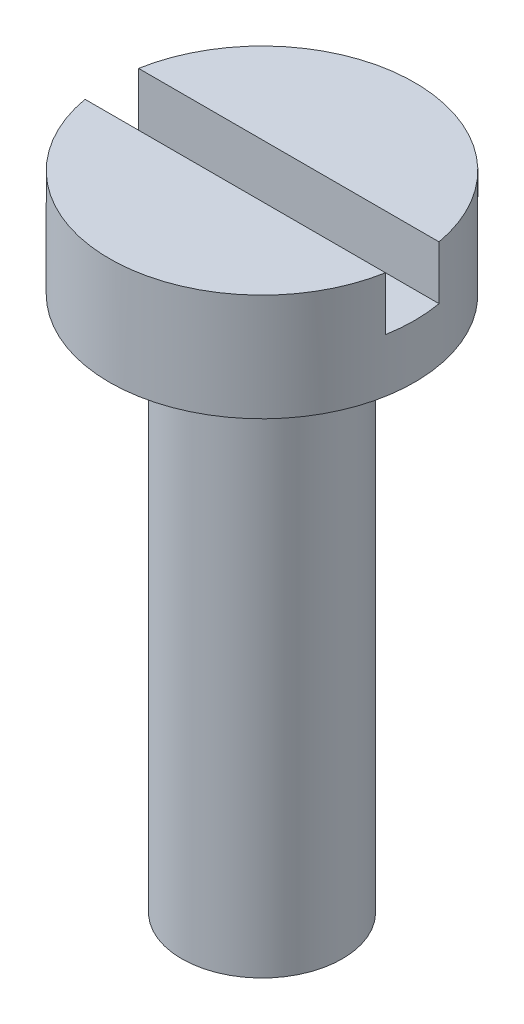
ISO-10303-21;
HEADER;
FILE_DESCRIPTION(('STEP AP214'),'2;1');
FILE_NAME('part.step','',(''),(''),'','','');
FILE_SCHEMA(('AUTOMOTIVE_DESIGN { 1 0 10303 214 1 1 1 1 }'));
ENDSEC;
DATA;
#1=APPLICATION_CONTEXT('core data for automotive mechanical design processes');
#2=APPLICATION_PROTOCOL_DEFINITION('international standard','automotive_design',2000,#1);
#3=PRODUCT_CONTEXT('',#1,'mechanical');
#4=PRODUCT('Part','Part','',(#3));
#5=PRODUCT_RELATED_PRODUCT_CATEGORY('part','',(#4));
#6=PRODUCT_DEFINITION_FORMATION('','',#4);
#7=PRODUCT_DEFINITION_CONTEXT('part definition',#1,'design');
#8=PRODUCT_DEFINITION('design','',#6,#7);
#9=PRODUCT_DEFINITION_SHAPE('','',#8);
#10=(LENGTH_UNIT() NAMED_UNIT(*) SI_UNIT(.MILLI.,.METRE.));
#11=(NAMED_UNIT(*) PLANE_ANGLE_UNIT() SI_UNIT($,.RADIAN.));
#12=(NAMED_UNIT(*) SI_UNIT($,.STERADIAN.) SOLID_ANGLE_UNIT());
#13=UNCERTAINTY_MEASURE_WITH_UNIT(LENGTH_MEASURE(1.E-05),#10,'distance_accuracy_value','');
#14=(GEOMETRIC_REPRESENTATION_CONTEXT(3) GLOBAL_UNCERTAINTY_ASSIGNED_CONTEXT((#13)) GLOBAL_UNIT_ASSIGNED_CONTEXT((#10,
#11,#12)) REPRESENTATION_CONTEXT('',''));
#15=CARTESIAN_POINT('',(0.,0.,0.));
#16=DIRECTION('',(0.,0.,1.));
#17=DIRECTION('',(1.,0.,0.));
#18=AXIS2_PLACEMENT_3D('',#15,#16,#17);
#19=CARTESIAN_POINT('',(0.,2.,0.));
#20=DIRECTION('',(0.,1.,0.));
#21=DIRECTION('',(0.,0.,1.));
#22=AXIS2_PLACEMENT_3D('',#19,#20,#21);
#23=PLANE('',#22);
#24=DIRECTION('',(1.,0.,0.));
#25=VECTOR('',#24,1.);
#26=CARTESIAN_POINT('',(0.,2.,0.5));
#27=LINE('',#26,#25);
#28=CARTESIAN_POINT('',(-2.80579756931964,2.,0.5));
#29=VERTEX_POINT('',#28);
#30=CARTESIAN_POINT('',(2.80579756931964,2.,0.5));
#31=VERTEX_POINT('',#30);
#32=EDGE_CURVE('E81',#29,#31,#27,.T.);
#33=ORIENTED_EDGE('',*,*,#32,.F.);
#34=CARTESIAN_POINT('',(0.,2.,0.));
#35=DIRECTION('',(0.,1.,0.));
#36=DIRECTION('',(0.,0.,1.));
#37=AXIS2_PLACEMENT_3D('',#34,#35,#36);
#38=CIRCLE('',#37,2.85);
#39=EDGE_CURVE('E91',#29,#31,#38,.T.);
#40=ORIENTED_EDGE('',*,*,#39,.T.);
#41=EDGE_LOOP('',(#33,#40));
#42=FACE_BOUND('',#41,.T.);
#43=ADVANCED_FACE('F33',(#42),#23,.T.);
#44=CARTESIAN_POINT('',(0.,2.,0.));
#45=DIRECTION('',(0.,-1.,0.));
#46=DIRECTION('',(0.,0.,-1.));
#47=AXIS2_PLACEMENT_3D('',#44,#45,#46);
#48=CYLINDRICAL_SURFACE('',#47,2.85);
#49=CARTESIAN_POINT('',(0.,1.,0.));
#50=DIRECTION('',(0.,-1.,0.));
#51=DIRECTION('',(0.,0.,-1.));
#52=AXIS2_PLACEMENT_3D('',#49,#50,#51);
#53=CIRCLE('',#52,2.85);
#54=CARTESIAN_POINT('',(2.80579756931964,1.,-0.5));
#55=VERTEX_POINT('',#54);
#56=CARTESIAN_POINT('',(2.80579756931964,1.,0.5));
#57=VERTEX_POINT('',#56);
#58=EDGE_CURVE('E11',#55,#57,#53,.T.);
#59=ORIENTED_EDGE('',*,*,#58,.T.);
#60=DIRECTION('',(0.,-1.,0.));
#61=VECTOR('',#60,1.);
#62=CARTESIAN_POINT('',(2.80579756931964,2.,0.5));
#63=LINE('',#62,#61);
#64=EDGE_CURVE('E56',#57,#31,#63,.F.);
#65=ORIENTED_EDGE('',*,*,#64,.T.);
#66=ORIENTED_EDGE('',*,*,#39,.F.);
#67=DIRECTION('',(0.,-1.,0.));
#68=VECTOR('',#67,1.);
#69=CARTESIAN_POINT('',(-2.80579756931964,2.,0.5));
#70=LINE('',#69,#68);
#71=CARTESIAN_POINT('',(-2.80579756931964,1.,0.5));
#72=VERTEX_POINT('',#71);
#73=EDGE_CURVE('E103',#29,#72,#70,.T.);
#74=ORIENTED_EDGE('',*,*,#73,.T.);
#75=CARTESIAN_POINT('',(-2.80579756931964,1.,-0.5));
#76=VERTEX_POINT('',#75);
#77=EDGE_CURVE('E37',#72,#76,#53,.T.);
#78=ORIENTED_EDGE('',*,*,#77,.T.);
#79=DIRECTION('',(0.,-1.,0.));
#80=VECTOR('',#79,1.);
#81=CARTESIAN_POINT('',(-2.80579756931964,2.,-0.5));
#82=LINE('',#81,#80);
#83=CARTESIAN_POINT('',(-2.80579756931964,2.,-0.5));
#84=VERTEX_POINT('',#83);
#85=EDGE_CURVE('E76',#76,#84,#82,.F.);
#86=ORIENTED_EDGE('',*,*,#85,.T.);
#87=CARTESIAN_POINT('',(2.80579756931964,2.,-0.5));
#88=VERTEX_POINT('',#87);
#89=EDGE_CURVE('E82',#88,#84,#38,.T.);
#90=ORIENTED_EDGE('',*,*,#89,.F.);
#91=DIRECTION('',(0.,-1.,0.));
#92=VECTOR('',#91,1.);
#93=CARTESIAN_POINT('',(2.80579756931964,2.,-0.5));
#94=LINE('',#93,#92);
#95=EDGE_CURVE('E48',#88,#55,#94,.T.);
#96=ORIENTED_EDGE('',*,*,#95,.T.);
#97=EDGE_LOOP('',(#59,#65,#66,#74,#78,#86,#90,#96));
#98=FACE_BOUND('',#97,.T.);
#99=CARTESIAN_POINT('',(0.,0.,0.));
#100=DIRECTION('',(0.,1.,0.));
#101=DIRECTION('',(0.,0.,1.));
#102=AXIS2_PLACEMENT_3D('',#99,#100,#101);
#103=CIRCLE('',#102,2.85);
#104=CARTESIAN_POINT('',(0.,0.,2.85));
#105=VERTEX_POINT('',#104);
#106=EDGE_CURVE('E94',#105,#105,#103,.T.);
#107=ORIENTED_EDGE('',*,*,#106,.T.);
#108=EDGE_LOOP('',(#107));
#109=FACE_BOUND('',#108,.T.);
#110=ADVANCED_FACE('F35',(#98,#109),#48,.T.);
#111=DIRECTION('',(-1.,0.,0.));
#112=VECTOR('',#111,1.);
#113=CARTESIAN_POINT('',(0.,2.,-0.5));
#114=LINE('',#113,#112);
#115=EDGE_CURVE('E73',#88,#84,#114,.T.);
#116=ORIENTED_EDGE('',*,*,#115,.F.);
#117=ORIENTED_EDGE('',*,*,#89,.T.);
#118=EDGE_LOOP('',(#116,#117));
#119=FACE_BOUND('',#118,.T.);
#120=ADVANCED_FACE('F90',(#119),#23,.T.);
#121=CARTESIAN_POINT('',(0.,0.,0.));
#122=DIRECTION('',(0.,1.,0.));
#123=DIRECTION('',(0.,0.,1.));
#124=AXIS2_PLACEMENT_3D('',#121,#122,#123);
#125=PLANE('',#124);
#126=CARTESIAN_POINT('',(0.,0.,0.));
#127=DIRECTION('',(0.,1.,0.));
#128=DIRECTION('',(0.,0.,1.));
#129=AXIS2_PLACEMENT_3D('',#126,#127,#128);
#130=CIRCLE('',#129,1.5);
#131=CARTESIAN_POINT('',(0.,0.,1.5));
#132=VERTEX_POINT('',#131);
#133=EDGE_CURVE('E97',#132,#132,#130,.T.);
#134=ORIENTED_EDGE('',*,*,#133,.T.);
#135=EDGE_LOOP('',(#134));
#136=FACE_BOUND('',#135,.T.);
#137=ORIENTED_EDGE('',*,*,#106,.F.);
#138=EDGE_LOOP('',(#137));
#139=FACE_BOUND('',#138,.T.);
#140=ADVANCED_FACE('F114',(#136,#139),#125,.F.);
#141=CARTESIAN_POINT('',(0.,-10.,0.));
#142=DIRECTION('',(0.,1.,0.));
#143=DIRECTION('',(0.,0.,1.));
#144=AXIS2_PLACEMENT_3D('',#141,#142,#143);
#145=CYLINDRICAL_SURFACE('',#144,1.5);
#146=CARTESIAN_POINT('',(0.,-10.,0.));
#147=DIRECTION('',(0.,1.,0.));
#148=DIRECTION('',(0.,0.,1.));
#149=AXIS2_PLACEMENT_3D('',#146,#147,#148);
#150=CIRCLE('',#149,1.5);
#151=CARTESIAN_POINT('',(0.,-10.,1.5));
#152=VERTEX_POINT('',#151);
#153=EDGE_CURVE('E100',#152,#152,#150,.T.);
#154=ORIENTED_EDGE('',*,*,#153,.T.);
#155=EDGE_LOOP('',(#154));
#156=FACE_BOUND('',#155,.T.);
#157=ORIENTED_EDGE('',*,*,#133,.F.);
#158=EDGE_LOOP('',(#157));
#159=FACE_BOUND('',#158,.T.);
#160=ADVANCED_FACE('F118',(#156,#159),#145,.T.);
#161=CARTESIAN_POINT('',(0.,-10.,0.));
#162=DIRECTION('',(0.,1.,0.));
#163=DIRECTION('',(0.,0.,1.));
#164=AXIS2_PLACEMENT_3D('',#161,#162,#163);
#165=PLANE('',#164);
#166=ORIENTED_EDGE('',*,*,#153,.F.);
#167=EDGE_LOOP('',(#166));
#168=FACE_BOUND('',#167,.T.);
#169=ADVANCED_FACE('F123',(#168),#165,.F.);
#170=CARTESIAN_POINT('',(0.,1.,0.));
#171=DIRECTION('',(0.,-1.,0.));
#172=DIRECTION('',(0.,0.,-1.));
#173=AXIS2_PLACEMENT_3D('',#170,#171,#172);
#174=PLANE('',#173);
#175=DIRECTION('',(-1.,0.,0.));
#176=VECTOR('',#175,1.);
#177=CARTESIAN_POINT('',(-3.,1.,-0.5));
#178=LINE('',#177,#176);
#179=EDGE_CURVE('E135',#55,#76,#178,.T.);
#180=ORIENTED_EDGE('',*,*,#179,.T.);
#181=ORIENTED_EDGE('',*,*,#77,.F.);
#182=DIRECTION('',(1.,0.,0.));
#183=VECTOR('',#182,1.);
#184=CARTESIAN_POINT('',(-3.,1.,0.5));
#185=LINE('',#184,#183);
#186=EDGE_CURVE('E88',#72,#57,#185,.T.);
#187=ORIENTED_EDGE('',*,*,#186,.T.);
#188=ORIENTED_EDGE('',*,*,#58,.F.);
#189=EDGE_LOOP('',(#180,#181,#187,#188));
#190=FACE_BOUND('',#189,.T.);
#191=ADVANCED_FACE('F137',(#190),#174,.F.);
#192=CARTESIAN_POINT('',(-3.,1.,0.5));
#193=DIRECTION('',(0.,0.,1.));
#194=DIRECTION('',(1.,0.,0.));
#195=AXIS2_PLACEMENT_3D('',#192,#193,#194);
#196=PLANE('',#195);
#197=ORIENTED_EDGE('',*,*,#32,.T.);
#198=ORIENTED_EDGE('',*,*,#64,.F.);
#199=ORIENTED_EDGE('',*,*,#186,.F.);
#200=ORIENTED_EDGE('',*,*,#73,.F.);
#201=EDGE_LOOP('',(#197,#198,#199,#200));
#202=FACE_BOUND('',#201,.T.);
#203=ADVANCED_FACE('F102',(#202),#196,.F.);
#204=CARTESIAN_POINT('',(-3.,1.,-0.5));
#205=DIRECTION('',(0.,0.,-1.));
#206=DIRECTION('',(-1.,0.,0.));
#207=AXIS2_PLACEMENT_3D('',#204,#205,#206);
#208=PLANE('',#207);
#209=ORIENTED_EDGE('',*,*,#115,.T.);
#210=ORIENTED_EDGE('',*,*,#85,.F.);
#211=ORIENTED_EDGE('',*,*,#179,.F.);
#212=ORIENTED_EDGE('',*,*,#95,.F.);
#213=EDGE_LOOP('',(#209,#210,#211,#212));
#214=FACE_BOUND('',#213,.T.);
#215=ADVANCED_FACE('F75',(#214),#208,.F.);
#216=CLOSED_SHELL('',(#43,#110,#120,#140,#160,#169,#191,#203,#215));
#217=MANIFOLD_SOLID_BREP('B2',#216);
#218=ADVANCED_BREP_SHAPE_REPRESENTATION('',(#18,#217),#14);
#219=SHAPE_DEFINITION_REPRESENTATION(#9,#218);
ENDSEC;
END-ISO-10303-21;
